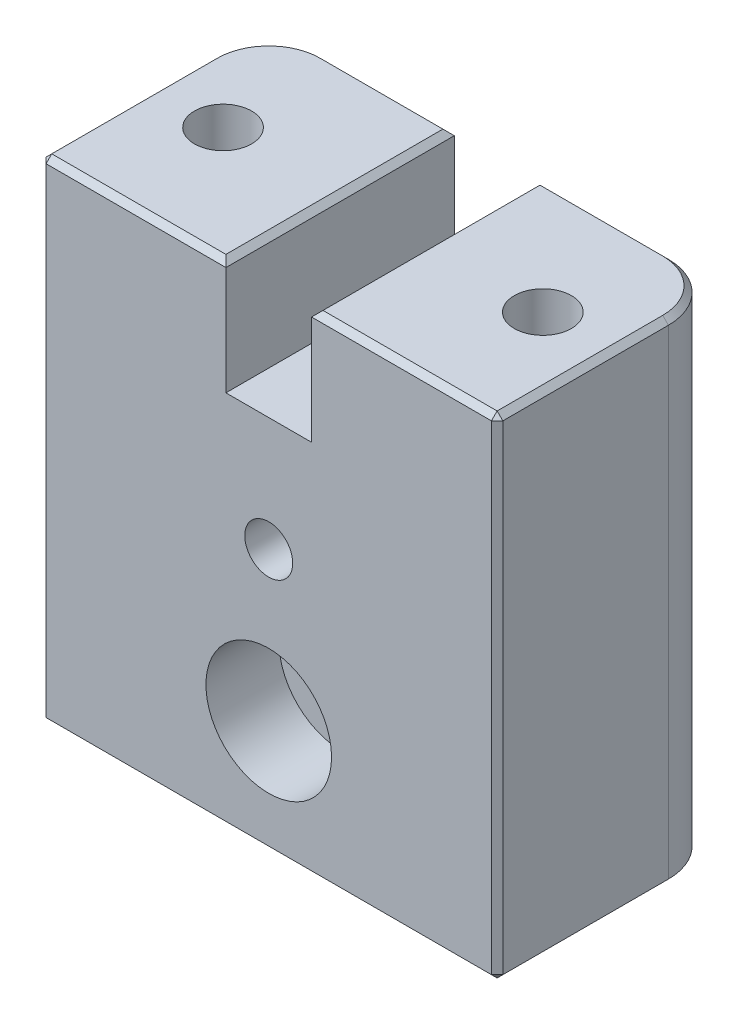
ISO-10303-21;
HEADER;
FILE_DESCRIPTION(('STEP AP214'),'2;1');
FILE_NAME('part.step','',(''),(''),'','','');
FILE_SCHEMA(('AUTOMOTIVE_DESIGN { 1 0 10303 214 1 1 1 1 }'));
ENDSEC;
DATA;
#1=APPLICATION_CONTEXT('core data for automotive mechanical design processes');
#2=APPLICATION_PROTOCOL_DEFINITION('international standard','automotive_design',2000,#1);
#3=PRODUCT_CONTEXT('',#1,'mechanical');
#4=PRODUCT('Part','Part','',(#3));
#5=PRODUCT_RELATED_PRODUCT_CATEGORY('part','',(#4));
#6=PRODUCT_DEFINITION_FORMATION('','',#4);
#7=PRODUCT_DEFINITION_CONTEXT('part definition',#1,'design');
#8=PRODUCT_DEFINITION('design','',#6,#7);
#9=PRODUCT_DEFINITION_SHAPE('','',#8);
#10=(LENGTH_UNIT() NAMED_UNIT(*) SI_UNIT(.MILLI.,.METRE.));
#11=(NAMED_UNIT(*) PLANE_ANGLE_UNIT() SI_UNIT($,.RADIAN.));
#12=(NAMED_UNIT(*) SI_UNIT($,.STERADIAN.) SOLID_ANGLE_UNIT());
#13=UNCERTAINTY_MEASURE_WITH_UNIT(LENGTH_MEASURE(1.E-05),#10,'distance_accuracy_value','');
#14=(GEOMETRIC_REPRESENTATION_CONTEXT(3) GLOBAL_UNCERTAINTY_ASSIGNED_CONTEXT((#13)) GLOBAL_UNIT_ASSIGNED_CONTEXT((#10,
#11,#12)) REPRESENTATION_CONTEXT('',''));
#15=CARTESIAN_POINT('',(0.,0.,0.));
#16=DIRECTION('',(0.,0.,1.));
#17=DIRECTION('',(1.,0.,0.));
#18=AXIS2_PLACEMENT_3D('',#15,#16,#17);
#19=CARTESIAN_POINT('',(-20.,21.5,20.));
#20=DIRECTION('',(0.,-1.,0.));
#21=DIRECTION('',(0.,0.,-1.));
#22=AXIS2_PLACEMENT_3D('',#19,#20,#21);
#23=PLANE('',#22);
#24=DIRECTION('',(0.,0.,-1.));
#25=VECTOR('',#24,1.);
#26=CARTESIAN_POINT('',(-4.25,21.5,20.));
#27=LINE('',#26,#25);
#28=CARTESIAN_POINT('',(-4.25,21.5,19.5));
#29=VERTEX_POINT('',#28);
#30=CARTESIAN_POINT('',(-4.25000000000001,21.5,0.500000000000007));
#31=VERTEX_POINT('',#30);
#32=EDGE_CURVE('E346',#29,#31,#27,.T.);
#33=ORIENTED_EDGE('',*,*,#32,.T.);
#34=DIRECTION('',(-1.,0.,0.));
#35=VECTOR('',#34,1.);
#36=CARTESIAN_POINT('',(-15.,21.5,0.500000000000007));
#37=LINE('',#36,#35);
#38=CARTESIAN_POINT('',(-15.,21.5,0.500000000000007));
#39=VERTEX_POINT('',#38);
#40=EDGE_CURVE('E352',#31,#39,#37,.T.);
#41=ORIENTED_EDGE('',*,*,#40,.T.);
#42=CARTESIAN_POINT('',(-15.,21.5,5.));
#43=DIRECTION('',(0.,-1.,0.));
#44=DIRECTION('',(0.,0.,-1.));
#45=AXIS2_PLACEMENT_3D('',#42,#43,#44);
#46=CIRCLE('',#45,4.49999999999999);
#47=CARTESIAN_POINT('',(-19.5,21.5,5.));
#48=VERTEX_POINT('',#47);
#49=EDGE_CURVE('E349',#39,#48,#46,.F.);
#50=ORIENTED_EDGE('',*,*,#49,.T.);
#51=DIRECTION('',(0.,0.,1.));
#52=VECTOR('',#51,1.);
#53=CARTESIAN_POINT('',(-19.5,21.5,20.));
#54=LINE('',#53,#52);
#55=CARTESIAN_POINT('',(-19.5,21.5,19.5));
#56=VERTEX_POINT('',#55);
#57=EDGE_CURVE('E340',#48,#56,#54,.T.);
#58=ORIENTED_EDGE('',*,*,#57,.T.);
#59=DIRECTION('',(1.,0.,0.));
#60=VECTOR('',#59,1.);
#61=CARTESIAN_POINT('',(-20.,21.5,19.5));
#62=LINE('',#61,#60);
#63=EDGE_CURVE('E343',#56,#29,#62,.T.);
#64=ORIENTED_EDGE('',*,*,#63,.T.);
#65=EDGE_LOOP('',(#33,#41,#50,#58,#64));
#66=FACE_BOUND('',#65,.T.);
#67=CARTESIAN_POINT('',(-14.,21.5,10.));
#68=DIRECTION('',(0.,1.,0.));
#69=DIRECTION('',(0.,0.,1.));
#70=AXIS2_PLACEMENT_3D('',#67,#68,#69);
#71=CIRCLE('',#70,2.5);
#72=CARTESIAN_POINT('',(-14.,21.5,12.5));
#73=VERTEX_POINT('',#72);
#74=EDGE_CURVE('E249',#73,#73,#71,.T.);
#75=ORIENTED_EDGE('',*,*,#74,.F.);
#76=EDGE_LOOP('',(#75));
#77=FACE_BOUND('',#76,.T.);
#78=ADVANCED_FACE('F68',(#66,#77),#23,.F.);
#79=CARTESIAN_POINT('',(20.,-21.5,20.));
#80=DIRECTION('',(-1.,0.,0.));
#81=DIRECTION('',(0.,0.,1.));
#82=AXIS2_PLACEMENT_3D('',#79,#80,#81);
#83=PLANE('',#82);
#84=DIRECTION('',(0.,-1.,0.));
#85=VECTOR('',#84,1.);
#86=CARTESIAN_POINT('',(20.,-21.5,19.5));
#87=LINE('',#86,#85);
#88=CARTESIAN_POINT('',(20.,21.,19.5));
#89=VERTEX_POINT('',#88);
#90=CARTESIAN_POINT('',(20.,-21.,19.5));
#91=VERTEX_POINT('',#90);
#92=EDGE_CURVE('E86',#89,#91,#87,.T.);
#93=ORIENTED_EDGE('',*,*,#92,.T.);
#94=DIRECTION('',(0.,0.,-1.));
#95=VECTOR('',#94,1.);
#96=CARTESIAN_POINT('',(20.,-21.,20.));
#97=LINE('',#96,#95);
#98=CARTESIAN_POINT('',(20.,-21.,5.));
#99=VERTEX_POINT('',#98);
#100=EDGE_CURVE('E13',#91,#99,#97,.T.);
#101=ORIENTED_EDGE('',*,*,#100,.T.);
#102=DIRECTION('',(0.,1.,0.));
#103=VECTOR('',#102,1.);
#104=CARTESIAN_POINT('',(20.,21.5,5.));
#105=LINE('',#104,#103);
#106=CARTESIAN_POINT('',(20.,21.,5.));
#107=VERTEX_POINT('',#106);
#108=EDGE_CURVE('E308',#99,#107,#105,.T.);
#109=ORIENTED_EDGE('',*,*,#108,.T.);
#110=DIRECTION('',(0.,0.,1.));
#111=VECTOR('',#110,1.);
#112=CARTESIAN_POINT('',(20.,21.,20.));
#113=LINE('',#112,#111);
#114=EDGE_CURVE('E79',#107,#89,#113,.T.);
#115=ORIENTED_EDGE('',*,*,#114,.T.);
#116=EDGE_LOOP('',(#93,#101,#109,#115));
#117=FACE_BOUND('',#116,.T.);
#118=ADVANCED_FACE('F601',(#117),#83,.F.);
#119=CARTESIAN_POINT('',(15.,21.5,5.));
#120=DIRECTION('',(0.,-1.,0.));
#121=DIRECTION('',(0.,0.,-1.));
#122=AXIS2_PLACEMENT_3D('',#119,#120,#121);
#123=CIRCLE('',#122,4.5);
#124=CARTESIAN_POINT('',(19.5,21.5,5.));
#125=VERTEX_POINT('',#124);
#126=CARTESIAN_POINT('',(15.,21.5,0.500000000000001));
#127=VERTEX_POINT('',#126);
#128=EDGE_CURVE('E365',#125,#127,#123,.F.);
#129=ORIENTED_EDGE('',*,*,#128,.T.);
#130=DIRECTION('',(-1.,0.,0.));
#131=VECTOR('',#130,1.);
#132=CARTESIAN_POINT('',(3.75,21.5,0.5));
#133=LINE('',#132,#131);
#134=CARTESIAN_POINT('',(4.25000000000001,21.5,0.5));
#135=VERTEX_POINT('',#134);
#136=EDGE_CURVE('E368',#127,#135,#133,.T.);
#137=ORIENTED_EDGE('',*,*,#136,.T.);
#138=DIRECTION('',(0.,0.,1.));
#139=VECTOR('',#138,1.);
#140=CARTESIAN_POINT('',(4.25000000000001,21.5,20.));
#141=LINE('',#140,#139);
#142=CARTESIAN_POINT('',(4.25000000000001,21.5,19.5));
#143=VERTEX_POINT('',#142);
#144=EDGE_CURVE('E362',#135,#143,#141,.T.);
#145=ORIENTED_EDGE('',*,*,#144,.T.);
#146=DIRECTION('',(1.,0.,0.));
#147=VECTOR('',#146,1.);
#148=CARTESIAN_POINT('',(-20.,21.5,19.5));
#149=LINE('',#148,#147);
#150=CARTESIAN_POINT('',(19.5,21.5,19.5));
#151=VERTEX_POINT('',#150);
#152=EDGE_CURVE('E359',#143,#151,#149,.T.);
#153=ORIENTED_EDGE('',*,*,#152,.T.);
#154=DIRECTION('',(0.,0.,-1.));
#155=VECTOR('',#154,1.);
#156=CARTESIAN_POINT('',(19.5,21.5,20.));
#157=LINE('',#156,#155);
#158=EDGE_CURVE('E356',#151,#125,#157,.T.);
#159=ORIENTED_EDGE('',*,*,#158,.T.);
#160=EDGE_LOOP('',(#129,#137,#145,#153,#159));
#161=FACE_BOUND('',#160,.T.);
#162=CARTESIAN_POINT('',(14.,21.5,10.));
#163=DIRECTION('',(0.,1.,0.));
#164=DIRECTION('',(0.,0.,1.));
#165=AXIS2_PLACEMENT_3D('',#162,#163,#164);
#166=CIRCLE('',#165,2.5);
#167=CARTESIAN_POINT('',(14.,21.5,12.5));
#168=VERTEX_POINT('',#167);
#169=EDGE_CURVE('E257',#168,#168,#166,.T.);
#170=ORIENTED_EDGE('',*,*,#169,.F.);
#171=EDGE_LOOP('',(#170));
#172=FACE_BOUND('',#171,.T.);
#173=ADVANCED_FACE('F603',(#161,#172),#23,.F.);
#174=CARTESIAN_POINT('',(-20.,-21.5,20.));
#175=DIRECTION('',(1.,0.,0.));
#176=DIRECTION('',(0.,0.,-1.));
#177=AXIS2_PLACEMENT_3D('',#174,#175,#176);
#178=PLANE('',#177);
#179=DIRECTION('',(0.,-1.,0.));
#180=VECTOR('',#179,1.);
#181=CARTESIAN_POINT('',(-20.,-21.5,5.));
#182=LINE('',#181,#180);
#183=CARTESIAN_POINT('',(-20.,21.,5.));
#184=VERTEX_POINT('',#183);
#185=CARTESIAN_POINT('',(-20.,-21.,5.));
#186=VERTEX_POINT('',#185);
#187=EDGE_CURVE('E285',#184,#186,#182,.T.);
#188=ORIENTED_EDGE('',*,*,#187,.T.);
#189=DIRECTION('',(0.,0.,1.));
#190=VECTOR('',#189,1.);
#191=CARTESIAN_POINT('',(-20.,-21.,20.));
#192=LINE('',#191,#190);
#193=CARTESIAN_POINT('',(-20.,-21.,19.5));
#194=VERTEX_POINT('',#193);
#195=EDGE_CURVE('E411',#186,#194,#192,.T.);
#196=ORIENTED_EDGE('',*,*,#195,.T.);
#197=DIRECTION('',(0.,1.,0.));
#198=VECTOR('',#197,1.);
#199=CARTESIAN_POINT('',(-20.,-21.5,19.5));
#200=LINE('',#199,#198);
#201=CARTESIAN_POINT('',(-20.,21.,19.5));
#202=VERTEX_POINT('',#201);
#203=EDGE_CURVE('E405',#194,#202,#200,.T.);
#204=ORIENTED_EDGE('',*,*,#203,.T.);
#205=DIRECTION('',(0.,0.,-1.));
#206=VECTOR('',#205,1.);
#207=CARTESIAN_POINT('',(-20.,21.,20.));
#208=LINE('',#207,#206);
#209=EDGE_CURVE('E408',#202,#184,#208,.T.);
#210=ORIENTED_EDGE('',*,*,#209,.T.);
#211=EDGE_LOOP('',(#188,#196,#204,#210));
#212=FACE_BOUND('',#211,.T.);
#213=ADVANCED_FACE('F555',(#212),#178,.F.);
#214=CARTESIAN_POINT('',(-20.,-21.5,20.));
#215=DIRECTION('',(0.,1.,0.));
#216=DIRECTION('',(0.,0.,1.));
#217=AXIS2_PLACEMENT_3D('',#214,#215,#216);
#218=PLANE('',#217);
#219=CARTESIAN_POINT('',(-15.,-21.5,5.));
#220=DIRECTION('',(0.,1.,0.));
#221=DIRECTION('',(0.,0.,1.));
#222=AXIS2_PLACEMENT_3D('',#219,#220,#221);
#223=CIRCLE('',#222,4.5);
#224=CARTESIAN_POINT('',(-19.5,-21.5,5.));
#225=VERTEX_POINT('',#224);
#226=CARTESIAN_POINT('',(-15.,-21.5,0.5));
#227=VERTEX_POINT('',#226);
#228=EDGE_CURVE('E323',#225,#227,#223,.F.);
#229=ORIENTED_EDGE('',*,*,#228,.T.);
#230=DIRECTION('',(1.,0.,0.));
#231=VECTOR('',#230,1.);
#232=CARTESIAN_POINT('',(15.,-21.5,0.5));
#233=LINE('',#232,#231);
#234=CARTESIAN_POINT('',(15.,-21.5,0.5));
#235=VERTEX_POINT('',#234);
#236=EDGE_CURVE('E326',#227,#235,#233,.T.);
#237=ORIENTED_EDGE('',*,*,#236,.T.);
#238=CARTESIAN_POINT('',(15.,-21.5,5.));
#239=DIRECTION('',(0.,1.,0.));
#240=DIRECTION('',(0.,0.,1.));
#241=AXIS2_PLACEMENT_3D('',#238,#239,#240);
#242=CIRCLE('',#241,4.5);
#243=CARTESIAN_POINT('',(19.5,-21.5,5.));
#244=VERTEX_POINT('',#243);
#245=EDGE_CURVE('E320',#235,#244,#242,.F.);
#246=ORIENTED_EDGE('',*,*,#245,.T.);
#247=DIRECTION('',(0.,0.,1.));
#248=VECTOR('',#247,1.);
#249=CARTESIAN_POINT('',(19.5,-21.5,20.));
#250=LINE('',#249,#248);
#251=CARTESIAN_POINT('',(19.5,-21.5,19.5));
#252=VERTEX_POINT('',#251);
#253=EDGE_CURVE('E314',#244,#252,#250,.T.);
#254=ORIENTED_EDGE('',*,*,#253,.T.);
#255=DIRECTION('',(-1.,0.,0.));
#256=VECTOR('',#255,1.);
#257=CARTESIAN_POINT('',(-20.,-21.5,19.5));
#258=LINE('',#257,#256);
#259=CARTESIAN_POINT('',(-19.5,-21.5,19.5));
#260=VERTEX_POINT('',#259);
#261=EDGE_CURVE('E311',#252,#260,#258,.T.);
#262=ORIENTED_EDGE('',*,*,#261,.T.);
#263=DIRECTION('',(0.,0.,-1.));
#264=VECTOR('',#263,1.);
#265=CARTESIAN_POINT('',(-19.5,-21.5,20.));
#266=LINE('',#265,#264);
#267=EDGE_CURVE('E317',#260,#225,#266,.T.);
#268=ORIENTED_EDGE('',*,*,#267,.T.);
#269=EDGE_LOOP('',(#229,#237,#246,#254,#262,#268));
#270=FACE_BOUND('',#269,.T.);
#271=ADVANCED_FACE('F569',(#270),#218,.F.);
#272=CARTESIAN_POINT('',(0.,0.,20.));
#273=DIRECTION('',(0.,0.,-1.));
#274=DIRECTION('',(-1.,0.,0.));
#275=AXIS2_PLACEMENT_3D('',#272,#273,#274);
#276=PLANE('',#275);
#277=CARTESIAN_POINT('',(0.,1.5,20.));
#278=DIRECTION('',(0.,0.,1.));
#279=DIRECTION('',(1.,0.,0.));
#280=AXIS2_PLACEMENT_3D('',#277,#278,#279);
#281=CIRCLE('',#280,2.09999999999999);
#282=CARTESIAN_POINT('',(2.09999999999999,1.5,20.));
#283=VERTEX_POINT('',#282);
#284=EDGE_CURVE('E226',#283,#283,#281,.T.);
#285=ORIENTED_EDGE('',*,*,#284,.F.);
#286=EDGE_LOOP('',(#285));
#287=FACE_BOUND('',#286,.T.);
#288=CARTESIAN_POINT('',(0.,-11.5,20.));
#289=DIRECTION('',(0.,0.,1.));
#290=DIRECTION('',(1.,0.,0.));
#291=AXIS2_PLACEMENT_3D('',#288,#289,#290);
#292=CIRCLE('',#291,5.5);
#293=CARTESIAN_POINT('',(5.5,-11.5,20.));
#294=VERTEX_POINT('',#293);
#295=EDGE_CURVE('E225',#294,#294,#292,.T.);
#296=ORIENTED_EDGE('',*,*,#295,.F.);
#297=EDGE_LOOP('',(#296));
#298=FACE_BOUND('',#297,.T.);
#299=DIRECTION('',(0.,1.,0.));
#300=VECTOR('',#299,1.);
#301=CARTESIAN_POINT('',(19.5,0.,20.));
#302=LINE('',#301,#300);
#303=CARTESIAN_POINT('',(19.5,-21.,20.));
#304=VERTEX_POINT('',#303);
#305=CARTESIAN_POINT('',(19.5,21.,20.));
#306=VERTEX_POINT('',#305);
#307=EDGE_CURVE('E390',#304,#306,#302,.T.);
#308=ORIENTED_EDGE('',*,*,#307,.T.);
#309=DIRECTION('',(-1.,0.,0.));
#310=VECTOR('',#309,1.);
#311=CARTESIAN_POINT('',(0.,21.,20.));
#312=LINE('',#311,#310);
#313=CARTESIAN_POINT('',(3.75,21.,20.));
#314=VERTEX_POINT('',#313);
#315=EDGE_CURVE('E402',#306,#314,#312,.T.);
#316=ORIENTED_EDGE('',*,*,#315,.T.);
#317=DIRECTION('',(0.,1.,0.));
#318=VECTOR('',#317,1.);
#319=CARTESIAN_POINT('',(3.75,11.5,20.));
#320=LINE('',#319,#318);
#321=CARTESIAN_POINT('',(3.75,11.5,20.));
#322=VERTEX_POINT('',#321);
#323=EDGE_CURVE('E290',#322,#314,#320,.T.);
#324=ORIENTED_EDGE('',*,*,#323,.F.);
#325=DIRECTION('',(1.,0.,0.));
#326=VECTOR('',#325,1.);
#327=CARTESIAN_POINT('',(-3.75,11.5,20.));
#328=LINE('',#327,#326);
#329=CARTESIAN_POINT('',(-3.75,11.5,20.));
#330=VERTEX_POINT('',#329);
#331=EDGE_CURVE('E269',#330,#322,#328,.T.);
#332=ORIENTED_EDGE('',*,*,#331,.F.);
#333=DIRECTION('',(0.,1.,0.));
#334=VECTOR('',#333,1.);
#335=CARTESIAN_POINT('',(-3.75,11.5,20.));
#336=LINE('',#335,#334);
#337=CARTESIAN_POINT('',(-3.75,21.,20.));
#338=VERTEX_POINT('',#337);
#339=EDGE_CURVE('E280',#330,#338,#336,.T.);
#340=ORIENTED_EDGE('',*,*,#339,.T.);
#341=DIRECTION('',(-1.,0.,0.));
#342=VECTOR('',#341,1.);
#343=CARTESIAN_POINT('',(0.,21.,20.));
#344=LINE('',#343,#342);
#345=CARTESIAN_POINT('',(-19.5,21.,20.));
#346=VERTEX_POINT('',#345);
#347=EDGE_CURVE('E399',#338,#346,#344,.T.);
#348=ORIENTED_EDGE('',*,*,#347,.T.);
#349=DIRECTION('',(0.,-1.,0.));
#350=VECTOR('',#349,1.);
#351=CARTESIAN_POINT('',(-19.5,0.,20.));
#352=LINE('',#351,#350);
#353=CARTESIAN_POINT('',(-19.5,-21.,20.));
#354=VERTEX_POINT('',#353);
#355=EDGE_CURVE('E396',#346,#354,#352,.T.);
#356=ORIENTED_EDGE('',*,*,#355,.T.);
#357=DIRECTION('',(1.,0.,0.));
#358=VECTOR('',#357,1.);
#359=CARTESIAN_POINT('',(0.,-21.,20.));
#360=LINE('',#359,#358);
#361=EDGE_CURVE('E393',#354,#304,#360,.T.);
#362=ORIENTED_EDGE('',*,*,#361,.T.);
#363=EDGE_LOOP('',(#308,#316,#324,#332,#340,#348,#356,#362));
#364=FACE_BOUND('',#363,.T.);
#365=ADVANCED_FACE('F533',(#287,#298,#364),#276,.F.);
#366=CARTESIAN_POINT('',(0.,0.,0.));
#367=DIRECTION('',(0.,0.,-1.));
#368=DIRECTION('',(-1.,0.,0.));
#369=AXIS2_PLACEMENT_3D('',#366,#367,#368);
#370=PLANE('',#369);
#371=CARTESIAN_POINT('',(0.,-11.5,0.));
#372=DIRECTION('',(0.,0.,1.));
#373=DIRECTION('',(1.,0.,0.));
#374=AXIS2_PLACEMENT_3D('',#371,#372,#373);
#375=CIRCLE('',#374,3.2);
#376=CARTESIAN_POINT('',(3.2,-11.5,0.));
#377=VERTEX_POINT('',#376);
#378=EDGE_CURVE('E244',#377,#377,#375,.T.);
#379=ORIENTED_EDGE('',*,*,#378,.T.);
#380=EDGE_LOOP('',(#379));
#381=FACE_BOUND('',#380,.T.);
#382=DIRECTION('',(0.,1.,0.));
#383=VECTOR('',#382,1.);
#384=CARTESIAN_POINT('',(15.,-21.5,0.));
#385=LINE('',#384,#383);
#386=CARTESIAN_POINT('',(15.,21.,0.));
#387=VERTEX_POINT('',#386);
#388=CARTESIAN_POINT('',(15.,-21.,0.));
#389=VERTEX_POINT('',#388);
#390=EDGE_CURVE('E300',#387,#389,#385,.F.);
#391=ORIENTED_EDGE('',*,*,#390,.T.);
#392=DIRECTION('',(-1.,0.,0.));
#393=VECTOR('',#392,1.);
#394=CARTESIAN_POINT('',(-15.,-21.,0.));
#395=LINE('',#394,#393);
#396=CARTESIAN_POINT('',(-15.,-21.,0.));
#397=VERTEX_POINT('',#396);
#398=EDGE_CURVE('E336',#389,#397,#395,.T.);
#399=ORIENTED_EDGE('',*,*,#398,.T.);
#400=DIRECTION('',(0.,-1.,0.));
#401=VECTOR('',#400,1.);
#402=CARTESIAN_POINT('',(-15.,21.5,0.));
#403=LINE('',#402,#401);
#404=CARTESIAN_POINT('',(-15.,21.,0.));
#405=VERTEX_POINT('',#404);
#406=EDGE_CURVE('E304',#397,#405,#403,.F.);
#407=ORIENTED_EDGE('',*,*,#406,.T.);
#408=DIRECTION('',(1.,0.,0.));
#409=VECTOR('',#408,1.);
#410=CARTESIAN_POINT('',(-3.75,21.,0.));
#411=LINE('',#410,#409);
#412=CARTESIAN_POINT('',(-3.75,21.,0.));
#413=VERTEX_POINT('',#412);
#414=EDGE_CURVE('E333',#405,#413,#411,.T.);
#415=ORIENTED_EDGE('',*,*,#414,.T.);
#416=DIRECTION('',(0.,1.,0.));
#417=VECTOR('',#416,1.);
#418=CARTESIAN_POINT('',(-3.75,11.5,0.));
#419=LINE('',#418,#417);
#420=CARTESIAN_POINT('',(-3.75,11.5,0.));
#421=VERTEX_POINT('',#420);
#422=EDGE_CURVE('E281',#421,#413,#419,.T.);
#423=ORIENTED_EDGE('',*,*,#422,.F.);
#424=DIRECTION('',(-1.,0.,0.));
#425=VECTOR('',#424,1.);
#426=CARTESIAN_POINT('',(-3.75,11.5,0.));
#427=LINE('',#426,#425);
#428=CARTESIAN_POINT('',(3.75,11.5,0.));
#429=VERTEX_POINT('',#428);
#430=EDGE_CURVE('E276',#429,#421,#427,.T.);
#431=ORIENTED_EDGE('',*,*,#430,.F.);
#432=DIRECTION('',(0.,1.,0.));
#433=VECTOR('',#432,1.);
#434=CARTESIAN_POINT('',(3.75,11.5,0.));
#435=LINE('',#434,#433);
#436=CARTESIAN_POINT('',(3.75,21.,0.));
#437=VERTEX_POINT('',#436);
#438=EDGE_CURVE('E286',#429,#437,#435,.T.);
#439=ORIENTED_EDGE('',*,*,#438,.T.);
#440=DIRECTION('',(1.,0.,0.));
#441=VECTOR('',#440,1.);
#442=CARTESIAN_POINT('',(15.,21.,0.));
#443=LINE('',#442,#441);
#444=EDGE_CURVE('E330',#437,#387,#443,.T.);
#445=ORIENTED_EDGE('',*,*,#444,.T.);
#446=EDGE_LOOP('',(#391,#399,#407,#415,#423,#431,#439,#445));
#447=FACE_BOUND('',#446,.T.);
#448=ADVANCED_FACE('F546',(#381,#447),#370,.T.);
#449=CARTESIAN_POINT('',(-3.75,11.5,0.));
#450=DIRECTION('',(-1.,0.,0.));
#451=DIRECTION('',(0.,0.,1.));
#452=AXIS2_PLACEMENT_3D('',#449,#450,#451);
#453=PLANE('',#452);
#454=ORIENTED_EDGE('',*,*,#422,.T.);
#455=DIRECTION('',(0.,0.,1.));
#456=VECTOR('',#455,1.);
#457=CARTESIAN_POINT('',(-3.75,21.,0.));
#458=LINE('',#457,#456);
#459=EDGE_CURVE('E384',#413,#338,#458,.T.);
#460=ORIENTED_EDGE('',*,*,#459,.T.);
#461=ORIENTED_EDGE('',*,*,#339,.F.);
#462=DIRECTION('',(0.,0.,1.));
#463=VECTOR('',#462,1.);
#464=CARTESIAN_POINT('',(-3.75,11.5,0.));
#465=LINE('',#464,#463);
#466=EDGE_CURVE('E265',#421,#330,#465,.T.);
#467=ORIENTED_EDGE('',*,*,#466,.F.);
#468=EDGE_LOOP('',(#454,#460,#461,#467));
#469=FACE_BOUND('',#468,.T.);
#470=ADVANCED_FACE('F539',(#469),#453,.F.);
#471=CARTESIAN_POINT('',(3.75,11.5,0.));
#472=DIRECTION('',(1.,0.,0.));
#473=DIRECTION('',(0.,0.,-1.));
#474=AXIS2_PLACEMENT_3D('',#471,#472,#473);
#475=PLANE('',#474);
#476=ORIENTED_EDGE('',*,*,#323,.T.);
#477=DIRECTION('',(0.,0.,-1.));
#478=VECTOR('',#477,1.);
#479=CARTESIAN_POINT('',(3.75,21.,0.));
#480=LINE('',#479,#478);
#481=EDGE_CURVE('E387',#314,#437,#480,.T.);
#482=ORIENTED_EDGE('',*,*,#481,.T.);
#483=ORIENTED_EDGE('',*,*,#438,.F.);
#484=DIRECTION('',(0.,0.,-1.));
#485=VECTOR('',#484,1.);
#486=CARTESIAN_POINT('',(3.75,11.5,0.));
#487=LINE('',#486,#485);
#488=EDGE_CURVE('E273',#322,#429,#487,.T.);
#489=ORIENTED_EDGE('',*,*,#488,.F.);
#490=EDGE_LOOP('',(#476,#482,#483,#489));
#491=FACE_BOUND('',#490,.T.);
#492=ADVANCED_FACE('F641',(#491),#475,.F.);
#493=CARTESIAN_POINT('',(0.,11.5,0.));
#494=DIRECTION('',(0.,1.,0.));
#495=DIRECTION('',(0.,0.,1.));
#496=AXIS2_PLACEMENT_3D('',#493,#494,#495);
#497=PLANE('',#496);
#498=ORIENTED_EDGE('',*,*,#466,.T.);
#499=ORIENTED_EDGE('',*,*,#331,.T.);
#500=ORIENTED_EDGE('',*,*,#488,.T.);
#501=ORIENTED_EDGE('',*,*,#430,.T.);
#502=EDGE_LOOP('',(#498,#499,#500,#501));
#503=FACE_BOUND('',#502,.T.);
#504=ADVANCED_FACE('F541',(#503),#497,.T.);
#505=CARTESIAN_POINT('',(14.,6.5,10.));
#506=DIRECTION('',(0.,1.,0.));
#507=DIRECTION('',(0.,0.,1.));
#508=AXIS2_PLACEMENT_3D('',#505,#506,#507);
#509=CONICAL_SURFACE('',#508,2.5,1.02974425867665);
#510=CARTESIAN_POINT('',(14.,4.9978484524311,10.));
#511=VERTEX_POINT('',#510);
#512=VERTEX_LOOP('',#511);
#513=FACE_BOUND('',#512,.T.);
#514=CARTESIAN_POINT('',(14.,6.5,10.));
#515=DIRECTION('',(0.,1.,0.));
#516=DIRECTION('',(0.,0.,1.));
#517=AXIS2_PLACEMENT_3D('',#514,#515,#516);
#518=CIRCLE('',#517,2.5);
#519=CARTESIAN_POINT('',(14.,6.5,12.5));
#520=VERTEX_POINT('',#519);
#521=EDGE_CURVE('E261',#520,#520,#518,.T.);
#522=ORIENTED_EDGE('',*,*,#521,.T.);
#523=EDGE_LOOP('',(#522));
#524=FACE_BOUND('',#523,.T.);
#525=ADVANCED_FACE('F623',(#513,#524),#509,.F.);
#526=CARTESIAN_POINT('',(14.,21.5,10.));
#527=DIRECTION('',(0.,1.,0.));
#528=DIRECTION('',(0.,0.,1.));
#529=AXIS2_PLACEMENT_3D('',#526,#527,#528);
#530=CYLINDRICAL_SURFACE('',#529,2.5);
#531=ORIENTED_EDGE('',*,*,#521,.F.);
#532=EDGE_LOOP('',(#531));
#533=FACE_BOUND('',#532,.T.);
#534=ORIENTED_EDGE('',*,*,#169,.T.);
#535=EDGE_LOOP('',(#534));
#536=FACE_BOUND('',#535,.T.);
#537=ADVANCED_FACE('F620',(#533,#536),#530,.F.);
#538=CARTESIAN_POINT('',(-14.,6.5,10.));
#539=DIRECTION('',(0.,1.,0.));
#540=DIRECTION('',(0.,0.,1.));
#541=AXIS2_PLACEMENT_3D('',#538,#539,#540);
#542=CONICAL_SURFACE('',#541,2.5,1.02974425867665);
#543=CARTESIAN_POINT('',(-14.,4.9978484524311,10.));
#544=VERTEX_POINT('',#543);
#545=VERTEX_LOOP('',#544);
#546=FACE_BOUND('',#545,.T.);
#547=CARTESIAN_POINT('',(-14.,6.5,10.));
#548=DIRECTION('',(0.,1.,0.));
#549=DIRECTION('',(0.,0.,1.));
#550=AXIS2_PLACEMENT_3D('',#547,#548,#549);
#551=CIRCLE('',#550,2.5);
#552=CARTESIAN_POINT('',(-14.,6.5,12.5));
#553=VERTEX_POINT('',#552);
#554=EDGE_CURVE('E253',#553,#553,#551,.T.);
#555=ORIENTED_EDGE('',*,*,#554,.T.);
#556=EDGE_LOOP('',(#555));
#557=FACE_BOUND('',#556,.T.);
#558=ADVANCED_FACE('F622',(#546,#557),#542,.F.);
#559=CARTESIAN_POINT('',(-14.,21.5,10.));
#560=DIRECTION('',(0.,1.,0.));
#561=DIRECTION('',(0.,0.,1.));
#562=AXIS2_PLACEMENT_3D('',#559,#560,#561);
#563=CYLINDRICAL_SURFACE('',#562,2.5);
#564=ORIENTED_EDGE('',*,*,#554,.F.);
#565=EDGE_LOOP('',(#564));
#566=FACE_BOUND('',#565,.T.);
#567=ORIENTED_EDGE('',*,*,#74,.T.);
#568=EDGE_LOOP('',(#567));
#569=FACE_BOUND('',#568,.T.);
#570=ADVANCED_FACE('F630',(#566,#569),#563,.F.);
#571=CARTESIAN_POINT('',(-15.,-21.5,5.));
#572=DIRECTION('',(0.,1.,0.));
#573=DIRECTION('',(0.,0.,1.));
#574=AXIS2_PLACEMENT_3D('',#571,#572,#573);
#575=CYLINDRICAL_SURFACE('',#574,5.);
#576=ORIENTED_EDGE('',*,*,#406,.F.);
#577=CARTESIAN_POINT('',(-15.,-21.,5.));
#578=DIRECTION('',(0.,1.,0.));
#579=DIRECTION('',(0.,0.,1.));
#580=AXIS2_PLACEMENT_3D('',#577,#578,#579);
#581=CIRCLE('',#580,5.);
#582=EDGE_CURVE('E375',#397,#186,#581,.T.);
#583=ORIENTED_EDGE('',*,*,#582,.T.);
#584=ORIENTED_EDGE('',*,*,#187,.F.);
#585=CARTESIAN_POINT('',(-15.,21.,5.));
#586=DIRECTION('',(0.,-1.,0.));
#587=DIRECTION('',(0.,0.,-1.));
#588=AXIS2_PLACEMENT_3D('',#585,#586,#587);
#589=CIRCLE('',#588,5.);
#590=EDGE_CURVE('E372',#184,#405,#589,.T.);
#591=ORIENTED_EDGE('',*,*,#590,.T.);
#592=EDGE_LOOP('',(#576,#583,#584,#591));
#593=FACE_BOUND('',#592,.T.);
#594=ADVANCED_FACE('F550',(#593),#575,.T.);
#595=CARTESIAN_POINT('',(15.,-21.5,5.));
#596=DIRECTION('',(0.,-1.,0.));
#597=DIRECTION('',(0.,0.,-1.));
#598=AXIS2_PLACEMENT_3D('',#595,#596,#597);
#599=CYLINDRICAL_SURFACE('',#598,5.);
#600=ORIENTED_EDGE('',*,*,#108,.F.);
#601=CARTESIAN_POINT('',(15.,-21.,5.));
#602=DIRECTION('',(0.,1.,0.));
#603=DIRECTION('',(0.,0.,1.));
#604=AXIS2_PLACEMENT_3D('',#601,#602,#603);
#605=CIRCLE('',#604,5.);
#606=EDGE_CURVE('E381',#99,#389,#605,.T.);
#607=ORIENTED_EDGE('',*,*,#606,.T.);
#608=ORIENTED_EDGE('',*,*,#390,.F.);
#609=CARTESIAN_POINT('',(15.,21.,5.));
#610=DIRECTION('',(0.,-1.,0.));
#611=DIRECTION('',(0.,0.,-1.));
#612=AXIS2_PLACEMENT_3D('',#609,#610,#611);
#613=CIRCLE('',#612,5.);
#614=EDGE_CURVE('E378',#387,#107,#613,.T.);
#615=ORIENTED_EDGE('',*,*,#614,.T.);
#616=EDGE_LOOP('',(#600,#607,#608,#615));
#617=FACE_BOUND('',#616,.T.);
#618=ADVANCED_FACE('F678',(#617),#599,.T.);
#619=CARTESIAN_POINT('',(-20.,21.5,0.500000000000007));
#620=DIRECTION('',(0.,0.707106781186552,-0.707106781186542));
#621=DIRECTION('',(1.,0.,0.));
#622=AXIS2_PLACEMENT_3D('',#619,#620,#621);
#623=PLANE('',#622);
#624=DIRECTION('',(0.577350269189628,-0.577350269189621,-0.577350269189629));
#625=VECTOR('',#624,1.);
#626=CARTESIAN_POINT('',(-3.75,21.,0.));
#627=LINE('',#626,#625);
#628=EDGE_CURVE('E502',#413,#31,#627,.F.);
#629=ORIENTED_EDGE('',*,*,#628,.F.);
#630=ORIENTED_EDGE('',*,*,#414,.F.);
#631=DIRECTION('',(0.,-0.707106781186542,-0.707106781186552));
#632=VECTOR('',#631,1.);
#633=CARTESIAN_POINT('',(-15.,21.5,0.500000000000007));
#634=LINE('',#633,#632);
#635=EDGE_CURVE('E73',#39,#405,#634,.T.);
#636=ORIENTED_EDGE('',*,*,#635,.F.);
#637=ORIENTED_EDGE('',*,*,#40,.F.);
#638=EDGE_LOOP('',(#629,#630,#636,#637));
#639=FACE_BOUND('',#638,.T.);
#640=ADVANCED_FACE('F71',(#639),#623,.T.);
#641=CARTESIAN_POINT('',(-20.,21.5,0.5));
#642=DIRECTION('',(0.,0.707106781186542,-0.707106781186552));
#643=DIRECTION('',(1.,0.,0.));
#644=AXIS2_PLACEMENT_3D('',#641,#642,#643);
#645=PLANE('',#644);
#646=DIRECTION('',(0.,0.707106781186552,0.707106781186542));
#647=VECTOR('',#646,1.);
#648=CARTESIAN_POINT('',(15.,21.,0.));
#649=LINE('',#648,#647);
#650=EDGE_CURVE('E495',#387,#127,#649,.T.);
#651=ORIENTED_EDGE('',*,*,#650,.F.);
#652=ORIENTED_EDGE('',*,*,#444,.F.);
#653=DIRECTION('',(0.577350269189635,0.577350269189626,0.577350269189617));
#654=VECTOR('',#653,1.);
#655=CARTESIAN_POINT('',(3.75,21.,0.));
#656=LINE('',#655,#654);
#657=EDGE_CURVE('E499',#135,#437,#656,.F.);
#658=ORIENTED_EDGE('',*,*,#657,.F.);
#659=ORIENTED_EDGE('',*,*,#136,.F.);
#660=EDGE_LOOP('',(#651,#652,#658,#659));
#661=FACE_BOUND('',#660,.T.);
#662=ADVANCED_FACE('F695',(#661),#645,.T.);
#663=CARTESIAN_POINT('',(-15.,21.5,5.));
#664=DIRECTION('',(0.,-1.,0.));
#665=DIRECTION('',(0.,0.,-1.));
#666=AXIS2_PLACEMENT_3D('',#663,#664,#665);
#667=CONICAL_SURFACE('',#666,4.49999999999999,0.785398163397454);
#668=ORIENTED_EDGE('',*,*,#635,.T.);
#669=ORIENTED_EDGE('',*,*,#590,.F.);
#670=DIRECTION('',(-0.707106781186552,-0.707106781186542,0.));
#671=VECTOR('',#670,1.);
#672=CARTESIAN_POINT('',(-19.5,21.5,5.));
#673=LINE('',#672,#671);
#674=EDGE_CURVE('E491',#48,#184,#673,.T.);
#675=ORIENTED_EDGE('',*,*,#674,.F.);
#676=ORIENTED_EDGE('',*,*,#49,.F.);
#677=EDGE_LOOP('',(#668,#669,#675,#676));
#678=FACE_BOUND('',#677,.T.);
#679=ADVANCED_FACE('F516',(#678),#667,.T.);
#680=CARTESIAN_POINT('',(-3.75,21.,0.));
#681=DIRECTION('',(-0.707106781186543,-0.707106781186552,0.));
#682=DIRECTION('',(0.,0.,1.));
#683=AXIS2_PLACEMENT_3D('',#680,#681,#682);
#684=PLANE('',#683);
#685=ORIENTED_EDGE('',*,*,#628,.T.);
#686=ORIENTED_EDGE('',*,*,#32,.F.);
#687=DIRECTION('',(-0.577350269189628,0.577350269189621,-0.577350269189629));
#688=VECTOR('',#687,1.);
#689=CARTESIAN_POINT('',(-2.49999999999999,19.75,21.25));
#690=LINE('',#689,#688);
#691=EDGE_CURVE('E487',#338,#29,#690,.T.);
#692=ORIENTED_EDGE('',*,*,#691,.F.);
#693=ORIENTED_EDGE('',*,*,#459,.F.);
#694=EDGE_LOOP('',(#685,#686,#692,#693));
#695=FACE_BOUND('',#694,.T.);
#696=ADVANCED_FACE('F525',(#695),#684,.F.);
#697=CARTESIAN_POINT('',(3.75,21.,0.));
#698=DIRECTION('',(0.707106781186542,-0.707106781186553,0.));
#699=DIRECTION('',(0.,0.,-1.));
#700=AXIS2_PLACEMENT_3D('',#697,#698,#699);
#701=PLANE('',#700);
#702=ORIENTED_EDGE('',*,*,#657,.T.);
#703=ORIENTED_EDGE('',*,*,#481,.F.);
#704=DIRECTION('',(-0.577350269189629,-0.57735026918962,0.577350269189628));
#705=VECTOR('',#704,1.);
#706=CARTESIAN_POINT('',(2.49999999999999,19.75,21.25));
#707=LINE('',#706,#705);
#708=EDGE_CURVE('E483',#143,#314,#707,.T.);
#709=ORIENTED_EDGE('',*,*,#708,.F.);
#710=ORIENTED_EDGE('',*,*,#144,.F.);
#711=EDGE_LOOP('',(#702,#703,#709,#710));
#712=FACE_BOUND('',#711,.T.);
#713=ADVANCED_FACE('F716',(#712),#701,.F.);
#714=CARTESIAN_POINT('',(15.,21.5,5.));
#715=DIRECTION('',(0.,-1.,0.));
#716=DIRECTION('',(0.,0.,-1.));
#717=AXIS2_PLACEMENT_3D('',#714,#715,#716);
#718=CONICAL_SURFACE('',#717,4.5,0.785398163397441);
#719=ORIENTED_EDGE('',*,*,#650,.T.);
#720=ORIENTED_EDGE('',*,*,#128,.F.);
#721=DIRECTION('',(-0.707106781186542,0.707106781186552,0.));
#722=VECTOR('',#721,1.);
#723=CARTESIAN_POINT('',(20.,21.,5.));
#724=LINE('',#723,#722);
#725=EDGE_CURVE('E479',#107,#125,#724,.T.);
#726=ORIENTED_EDGE('',*,*,#725,.F.);
#727=ORIENTED_EDGE('',*,*,#614,.F.);
#728=EDGE_LOOP('',(#719,#720,#726,#727));
#729=FACE_BOUND('',#728,.T.);
#730=ADVANCED_FACE('F724',(#729),#718,.T.);
#731=CARTESIAN_POINT('',(-20.,21.,20.));
#732=DIRECTION('',(0.707106781186542,-0.707106781186552,0.));
#733=DIRECTION('',(0.,0.,-1.));
#734=AXIS2_PLACEMENT_3D('',#731,#732,#733);
#735=PLANE('',#734);
#736=ORIENTED_EDGE('',*,*,#674,.T.);
#737=ORIENTED_EDGE('',*,*,#209,.F.);
#738=DIRECTION('',(0.707106781186552,0.707106781186543,0.));
#739=VECTOR('',#738,1.);
#740=CARTESIAN_POINT('',(-19.75,21.25,19.5));
#741=LINE('',#740,#739);
#742=EDGE_CURVE('E475',#56,#202,#741,.F.);
#743=ORIENTED_EDGE('',*,*,#742,.F.);
#744=ORIENTED_EDGE('',*,*,#57,.F.);
#745=EDGE_LOOP('',(#736,#737,#743,#744));
#746=FACE_BOUND('',#745,.T.);
#747=ADVANCED_FACE('F582',(#746),#735,.F.);
#748=CARTESIAN_POINT('',(0.,21.,20.));
#749=DIRECTION('',(0.,-0.707106781186552,-0.707106781186542));
#750=DIRECTION('',(-1.,0.,0.));
#751=AXIS2_PLACEMENT_3D('',#748,#749,#750);
#752=PLANE('',#751);
#753=ORIENTED_EDGE('',*,*,#691,.T.);
#754=ORIENTED_EDGE('',*,*,#63,.F.);
#755=DIRECTION('',(0.,-0.707106781186543,0.707106781186552));
#756=VECTOR('',#755,1.);
#757=CARTESIAN_POINT('',(-19.5,21.,20.));
#758=LINE('',#757,#756);
#759=EDGE_CURVE('E471',#346,#56,#758,.F.);
#760=ORIENTED_EDGE('',*,*,#759,.F.);
#761=ORIENTED_EDGE('',*,*,#347,.F.);
#762=EDGE_LOOP('',(#753,#754,#760,#761));
#763=FACE_BOUND('',#762,.T.);
#764=ADVANCED_FACE('F528',(#763),#752,.F.);
#765=CARTESIAN_POINT('',(0.,21.,20.));
#766=DIRECTION('',(0.,-0.707106781186552,-0.707106781186542));
#767=DIRECTION('',(-1.,0.,0.));
#768=AXIS2_PLACEMENT_3D('',#765,#766,#767);
#769=PLANE('',#768);
#770=ORIENTED_EDGE('',*,*,#708,.T.);
#771=ORIENTED_EDGE('',*,*,#315,.F.);
#772=DIRECTION('',(0.,0.707106781186543,-0.707106781186552));
#773=VECTOR('',#772,1.);
#774=CARTESIAN_POINT('',(19.5,21.5,19.5));
#775=LINE('',#774,#773);
#776=EDGE_CURVE('E467',#151,#306,#775,.F.);
#777=ORIENTED_EDGE('',*,*,#776,.F.);
#778=ORIENTED_EDGE('',*,*,#152,.F.);
#779=EDGE_LOOP('',(#770,#771,#777,#778));
#780=FACE_BOUND('',#779,.T.);
#781=ADVANCED_FACE('F596',(#780),#769,.F.);
#782=CARTESIAN_POINT('',(19.5,21.5,20.));
#783=DIRECTION('',(-0.707106781186552,-0.707106781186542,0.));
#784=DIRECTION('',(0.,0.,-1.));
#785=AXIS2_PLACEMENT_3D('',#782,#783,#784);
#786=PLANE('',#785);
#787=ORIENTED_EDGE('',*,*,#725,.T.);
#788=ORIENTED_EDGE('',*,*,#158,.F.);
#789=DIRECTION('',(0.707106781186543,-0.707106781186552,0.));
#790=VECTOR('',#789,1.);
#791=CARTESIAN_POINT('',(19.5,21.5,19.5));
#792=LINE('',#791,#790);
#793=EDGE_CURVE('E463',#89,#151,#792,.F.);
#794=ORIENTED_EDGE('',*,*,#793,.F.);
#795=ORIENTED_EDGE('',*,*,#114,.F.);
#796=EDGE_LOOP('',(#787,#788,#794,#795));
#797=FACE_BOUND('',#796,.T.);
#798=ADVANCED_FACE('F588',(#797),#786,.F.);
#799=CARTESIAN_POINT('',(-19.5,21.,20.));
#800=DIRECTION('',(-0.577350269189626,0.577350269189634,0.577350269189618));
#801=DIRECTION('',(-0.707106781186552,-0.707106781186543,0.));
#802=AXIS2_PLACEMENT_3D('',#799,#800,#801);
#803=PLANE('',#802);
#804=ORIENTED_EDGE('',*,*,#759,.T.);
#805=ORIENTED_EDGE('',*,*,#742,.T.);
#806=DIRECTION('',(-0.707106781186543,0.,-0.707106781186552));
#807=VECTOR('',#806,1.);
#808=CARTESIAN_POINT('',(-19.5,21.,20.));
#809=LINE('',#808,#807);
#810=EDGE_CURVE('E459',#346,#202,#809,.T.);
#811=ORIENTED_EDGE('',*,*,#810,.F.);
#812=EDGE_LOOP('',(#804,#805,#811));
#813=FACE_BOUND('',#812,.T.);
#814=ADVANCED_FACE('F585',(#813),#803,.T.);
#815=CARTESIAN_POINT('',(19.5,21.5,19.5));
#816=DIRECTION('',(0.577350269189634,0.577350269189626,0.577350269189618));
#817=DIRECTION('',(-0.707106781186543,0.707106781186552,0.));
#818=AXIS2_PLACEMENT_3D('',#815,#816,#817);
#819=PLANE('',#818);
#820=ORIENTED_EDGE('',*,*,#793,.T.);
#821=ORIENTED_EDGE('',*,*,#776,.T.);
#822=DIRECTION('',(-0.707106781186543,0.,0.707106781186552));
#823=VECTOR('',#822,1.);
#824=CARTESIAN_POINT('',(19.75,21.,19.75));
#825=LINE('',#824,#823);
#826=EDGE_CURVE('E455',#89,#306,#825,.T.);
#827=ORIENTED_EDGE('',*,*,#826,.F.);
#828=EDGE_LOOP('',(#820,#821,#827));
#829=FACE_BOUND('',#828,.T.);
#830=ADVANCED_FACE('F587',(#829),#819,.T.);
#831=CARTESIAN_POINT('',(-19.5,0.,20.));
#832=DIRECTION('',(0.707106781186552,0.,-0.707106781186542));
#833=DIRECTION('',(0.,-1.,0.));
#834=AXIS2_PLACEMENT_3D('',#831,#832,#833);
#835=PLANE('',#834);
#836=ORIENTED_EDGE('',*,*,#810,.T.);
#837=ORIENTED_EDGE('',*,*,#203,.F.);
#838=DIRECTION('',(0.707106781186543,0.,0.707106781186552));
#839=VECTOR('',#838,1.);
#840=CARTESIAN_POINT('',(-20.,-21.,19.5));
#841=LINE('',#840,#839);
#842=EDGE_CURVE('E451',#354,#194,#841,.F.);
#843=ORIENTED_EDGE('',*,*,#842,.F.);
#844=ORIENTED_EDGE('',*,*,#355,.F.);
#845=EDGE_LOOP('',(#836,#837,#843,#844));
#846=FACE_BOUND('',#845,.T.);
#847=ADVANCED_FACE('F580',(#846),#835,.F.);
#848=CARTESIAN_POINT('',(0.,-21.,20.));
#849=DIRECTION('',(0.,0.707106781186552,-0.707106781186542));
#850=DIRECTION('',(1.,0.,0.));
#851=AXIS2_PLACEMENT_3D('',#848,#849,#850);
#852=PLANE('',#851);
#853=DIRECTION('',(0.,0.707106781186543,0.707106781186552));
#854=VECTOR('',#853,1.);
#855=CARTESIAN_POINT('',(19.5,-21.5,19.5));
#856=LINE('',#855,#854);
#857=EDGE_CURVE('E443',#304,#252,#856,.F.);
#858=ORIENTED_EDGE('',*,*,#857,.F.);
#859=ORIENTED_EDGE('',*,*,#361,.F.);
#860=DIRECTION('',(0.,-0.707106781186543,-0.707106781186552));
#861=VECTOR('',#860,1.);
#862=CARTESIAN_POINT('',(-19.5,-21.25,19.75));
#863=LINE('',#862,#861);
#864=EDGE_CURVE('E447',#260,#354,#863,.F.);
#865=ORIENTED_EDGE('',*,*,#864,.F.);
#866=ORIENTED_EDGE('',*,*,#261,.F.);
#867=EDGE_LOOP('',(#858,#859,#865,#866));
#868=FACE_BOUND('',#867,.T.);
#869=ADVANCED_FACE('F575',(#868),#852,.F.);
#870=CARTESIAN_POINT('',(19.5,0.,20.));
#871=DIRECTION('',(-0.707106781186552,0.,-0.707106781186542));
#872=DIRECTION('',(0.,1.,0.));
#873=AXIS2_PLACEMENT_3D('',#870,#871,#872);
#874=PLANE('',#873);
#875=ORIENTED_EDGE('',*,*,#826,.T.);
#876=ORIENTED_EDGE('',*,*,#307,.F.);
#877=DIRECTION('',(0.707106781186543,0.,-0.707106781186552));
#878=VECTOR('',#877,1.);
#879=CARTESIAN_POINT('',(19.75,-21.,19.75));
#880=LINE('',#879,#878);
#881=EDGE_CURVE('E439',#91,#304,#880,.F.);
#882=ORIENTED_EDGE('',*,*,#881,.F.);
#883=ORIENTED_EDGE('',*,*,#92,.F.);
#884=EDGE_LOOP('',(#875,#876,#882,#883));
#885=FACE_BOUND('',#884,.T.);
#886=ADVANCED_FACE('F789',(#885),#874,.F.);
#887=CARTESIAN_POINT('',(-20.,-21.,19.5));
#888=DIRECTION('',(-0.577350269189634,-0.577350269189626,0.577350269189618));
#889=DIRECTION('',(0.707106781186543,-0.707106781186552,0.));
#890=AXIS2_PLACEMENT_3D('',#887,#888,#889);
#891=PLANE('',#890);
#892=ORIENTED_EDGE('',*,*,#864,.T.);
#893=ORIENTED_EDGE('',*,*,#842,.T.);
#894=DIRECTION('',(-0.707106781186543,0.707106781186552,0.));
#895=VECTOR('',#894,1.);
#896=CARTESIAN_POINT('',(-20.,-21.,19.5));
#897=LINE('',#896,#895);
#898=EDGE_CURVE('E435',#260,#194,#897,.T.);
#899=ORIENTED_EDGE('',*,*,#898,.F.);
#900=EDGE_LOOP('',(#892,#893,#899));
#901=FACE_BOUND('',#900,.T.);
#902=ADVANCED_FACE('F578',(#901),#891,.T.);
#903=CARTESIAN_POINT('',(19.5,-21.5,19.5));
#904=DIRECTION('',(0.577350269189634,-0.577350269189626,0.577350269189618));
#905=DIRECTION('',(0.707106781186543,0.707106781186552,0.));
#906=AXIS2_PLACEMENT_3D('',#903,#904,#905);
#907=PLANE('',#906);
#908=ORIENTED_EDGE('',*,*,#881,.T.);
#909=ORIENTED_EDGE('',*,*,#857,.T.);
#910=DIRECTION('',(-0.707106781186543,-0.707106781186552,0.));
#911=VECTOR('',#910,1.);
#912=CARTESIAN_POINT('',(19.5,-21.5,19.5));
#913=LINE('',#912,#911);
#914=EDGE_CURVE('E431',#91,#252,#913,.T.);
#915=ORIENTED_EDGE('',*,*,#914,.F.);
#916=EDGE_LOOP('',(#908,#909,#915));
#917=FACE_BOUND('',#916,.T.);
#918=ADVANCED_FACE('F807',(#917),#907,.T.);
#919=CARTESIAN_POINT('',(-19.5,-21.5,20.));
#920=DIRECTION('',(0.707106781186552,0.707106781186542,0.));
#921=DIRECTION('',(0.,0.,-1.));
#922=AXIS2_PLACEMENT_3D('',#919,#920,#921);
#923=PLANE('',#922);
#924=ORIENTED_EDGE('',*,*,#898,.T.);
#925=ORIENTED_EDGE('',*,*,#195,.F.);
#926=DIRECTION('',(-0.707106781186542,0.707106781186552,0.));
#927=VECTOR('',#926,1.);
#928=CARTESIAN_POINT('',(-19.5,-21.5,5.));
#929=LINE('',#928,#927);
#930=EDGE_CURVE('E427',#225,#186,#929,.T.);
#931=ORIENTED_EDGE('',*,*,#930,.F.);
#932=ORIENTED_EDGE('',*,*,#267,.F.);
#933=EDGE_LOOP('',(#924,#925,#931,#932));
#934=FACE_BOUND('',#933,.T.);
#935=ADVANCED_FACE('F560',(#934),#923,.F.);
#936=CARTESIAN_POINT('',(20.,-21.,20.));
#937=DIRECTION('',(-0.707106781186552,0.707106781186542,0.));
#938=DIRECTION('',(0.,0.,-1.));
#939=AXIS2_PLACEMENT_3D('',#936,#937,#938);
#940=PLANE('',#939);
#941=ORIENTED_EDGE('',*,*,#914,.T.);
#942=ORIENTED_EDGE('',*,*,#253,.F.);
#943=DIRECTION('',(-0.707106781186542,-0.707106781186552,0.));
#944=VECTOR('',#943,1.);
#945=CARTESIAN_POINT('',(20.,-21.,5.));
#946=LINE('',#945,#944);
#947=EDGE_CURVE('E423',#99,#244,#946,.T.);
#948=ORIENTED_EDGE('',*,*,#947,.F.);
#949=ORIENTED_EDGE('',*,*,#100,.F.);
#950=EDGE_LOOP('',(#941,#942,#948,#949));
#951=FACE_BOUND('',#950,.T.);
#952=ADVANCED_FACE('F825',(#951),#940,.F.);
#953=CARTESIAN_POINT('',(-15.,-21.5,5.));
#954=DIRECTION('',(0.,1.,0.));
#955=DIRECTION('',(0.,0.,1.));
#956=AXIS2_PLACEMENT_3D('',#953,#954,#955);
#957=CONICAL_SURFACE('',#956,4.5,0.785398163397441);
#958=ORIENTED_EDGE('',*,*,#930,.T.);
#959=ORIENTED_EDGE('',*,*,#582,.F.);
#960=DIRECTION('',(0.,0.707106781186553,-0.707106781186542));
#961=VECTOR('',#960,1.);
#962=CARTESIAN_POINT('',(-15.,-21.5,0.5));
#963=LINE('',#962,#961);
#964=EDGE_CURVE('E420',#227,#397,#963,.T.);
#965=ORIENTED_EDGE('',*,*,#964,.F.);
#966=ORIENTED_EDGE('',*,*,#228,.F.);
#967=EDGE_LOOP('',(#958,#959,#965,#966));
#968=FACE_BOUND('',#967,.T.);
#969=ADVANCED_FACE('F565',(#968),#957,.T.);
#970=CARTESIAN_POINT('',(15.,-21.5,5.));
#971=DIRECTION('',(0.,1.,0.));
#972=DIRECTION('',(0.,0.,1.));
#973=AXIS2_PLACEMENT_3D('',#970,#971,#972);
#974=CONICAL_SURFACE('',#973,4.5,0.785398163397441);
#975=ORIENTED_EDGE('',*,*,#947,.T.);
#976=ORIENTED_EDGE('',*,*,#245,.F.);
#977=DIRECTION('',(0.,-0.707106781186553,0.707106781186542));
#978=VECTOR('',#977,1.);
#979=CARTESIAN_POINT('',(15.,-21.,0.));
#980=LINE('',#979,#978);
#981=EDGE_CURVE('E248',#389,#235,#980,.T.);
#982=ORIENTED_EDGE('',*,*,#981,.F.);
#983=ORIENTED_EDGE('',*,*,#606,.F.);
#984=EDGE_LOOP('',(#975,#976,#982,#983));
#985=FACE_BOUND('',#984,.T.);
#986=ADVANCED_FACE('F843',(#985),#974,.T.);
#987=CARTESIAN_POINT('',(-20.,-21.5,0.5));
#988=DIRECTION('',(0.,-0.707106781186542,-0.707106781186552));
#989=DIRECTION('',(-1.,0.,0.));
#990=AXIS2_PLACEMENT_3D('',#987,#988,#989);
#991=PLANE('',#990);
#992=ORIENTED_EDGE('',*,*,#964,.T.);
#993=ORIENTED_EDGE('',*,*,#398,.F.);
#994=ORIENTED_EDGE('',*,*,#981,.T.);
#995=ORIENTED_EDGE('',*,*,#236,.F.);
#996=EDGE_LOOP('',(#992,#993,#994,#995));
#997=FACE_BOUND('',#996,.T.);
#998=ADVANCED_FACE('F852',(#997),#991,.T.);
#999=CARTESIAN_POINT('',(0.,-11.5,20.));
#1000=DIRECTION('',(0.,0.,1.));
#1001=DIRECTION('',(1.,0.,0.));
#1002=AXIS2_PLACEMENT_3D('',#999,#1000,#1001);
#1003=CYLINDRICAL_SURFACE('',#1002,3.2);
#1004=ORIENTED_EDGE('',*,*,#378,.F.);
#1005=EDGE_LOOP('',(#1004));
#1006=FACE_BOUND('',#1005,.T.);
#1007=CARTESIAN_POINT('',(0.,-11.5,13.6));
#1008=DIRECTION('',(0.,0.,1.));
#1009=DIRECTION('',(1.,0.,0.));
#1010=AXIS2_PLACEMENT_3D('',#1007,#1008,#1009);
#1011=CIRCLE('',#1010,3.2);
#1012=CARTESIAN_POINT('',(3.2,-11.5,13.6));
#1013=VERTEX_POINT('',#1012);
#1014=EDGE_CURVE('E240',#1013,#1013,#1011,.T.);
#1015=ORIENTED_EDGE('',*,*,#1014,.T.);
#1016=EDGE_LOOP('',(#1015));
#1017=FACE_BOUND('',#1016,.T.);
#1018=ADVANCED_FACE('F862',(#1006,#1017),#1003,.F.);
#1019=CARTESIAN_POINT('',(3.2,-11.5,13.6));
#1020=DIRECTION('',(0.,0.,-1.));
#1021=DIRECTION('',(-1.,0.,0.));
#1022=AXIS2_PLACEMENT_3D('',#1019,#1020,#1021);
#1023=PLANE('',#1022);
#1024=ORIENTED_EDGE('',*,*,#1014,.F.);
#1025=EDGE_LOOP('',(#1024));
#1026=FACE_BOUND('',#1025,.T.);
#1027=CARTESIAN_POINT('',(0.,-11.5,13.6));
#1028=DIRECTION('',(0.,0.,1.));
#1029=DIRECTION('',(1.,0.,0.));
#1030=AXIS2_PLACEMENT_3D('',#1027,#1028,#1029);
#1031=CIRCLE('',#1030,5.5);
#1032=CARTESIAN_POINT('',(5.5,-11.5,13.6));
#1033=VERTEX_POINT('',#1032);
#1034=EDGE_CURVE('E232',#1033,#1033,#1031,.T.);
#1035=ORIENTED_EDGE('',*,*,#1034,.T.);
#1036=EDGE_LOOP('',(#1035));
#1037=FACE_BOUND('',#1036,.T.);
#1038=ADVANCED_FACE('F872',(#1026,#1037),#1023,.F.);
#1039=CARTESIAN_POINT('',(0.,-11.5,20.));
#1040=DIRECTION('',(0.,0.,1.));
#1041=DIRECTION('',(1.,0.,0.));
#1042=AXIS2_PLACEMENT_3D('',#1039,#1040,#1041);
#1043=CYLINDRICAL_SURFACE('',#1042,5.5);
#1044=ORIENTED_EDGE('',*,*,#1034,.F.);
#1045=EDGE_LOOP('',(#1044));
#1046=FACE_BOUND('',#1045,.T.);
#1047=ORIENTED_EDGE('',*,*,#295,.T.);
#1048=EDGE_LOOP('',(#1047));
#1049=FACE_BOUND('',#1048,.T.);
#1050=ADVANCED_FACE('F218',(#1046,#1049),#1043,.F.);
#1051=CARTESIAN_POINT('',(0.,1.5,7.6));
#1052=DIRECTION('',(0.,0.,1.));
#1053=DIRECTION('',(1.,0.,0.));
#1054=AXIS2_PLACEMENT_3D('',#1051,#1052,#1053);
#1055=CONICAL_SURFACE('',#1054,2.1,1.02974425867665);
#1056=CARTESIAN_POINT('',(0.,1.5,6.33819270004212));
#1057=VERTEX_POINT('',#1056);
#1058=VERTEX_LOOP('',#1057);
#1059=FACE_BOUND('',#1058,.T.);
#1060=CARTESIAN_POINT('',(0.,1.5,7.6));
#1061=DIRECTION('',(0.,0.,1.));
#1062=DIRECTION('',(1.,0.,0.));
#1063=AXIS2_PLACEMENT_3D('',#1060,#1061,#1062);
#1064=CIRCLE('',#1063,2.1);
#1065=CARTESIAN_POINT('',(2.1,1.5,7.6));
#1066=VERTEX_POINT('',#1065);
#1067=EDGE_CURVE('E222',#1066,#1066,#1064,.T.);
#1068=ORIENTED_EDGE('',*,*,#1067,.T.);
#1069=EDGE_LOOP('',(#1068));
#1070=FACE_BOUND('',#1069,.T.);
#1071=ADVANCED_FACE('F214',(#1059,#1070),#1055,.F.);
#1072=CARTESIAN_POINT('',(0.,1.5,20.));
#1073=DIRECTION('',(0.,0.,1.));
#1074=DIRECTION('',(1.,0.,0.));
#1075=AXIS2_PLACEMENT_3D('',#1072,#1073,#1074);
#1076=CYLINDRICAL_SURFACE('',#1075,2.09999999999999);
#1077=ORIENTED_EDGE('',*,*,#1067,.F.);
#1078=EDGE_LOOP('',(#1077));
#1079=FACE_BOUND('',#1078,.T.);
#1080=ORIENTED_EDGE('',*,*,#284,.T.);
#1081=EDGE_LOOP('',(#1080));
#1082=FACE_BOUND('',#1081,.T.);
#1083=ADVANCED_FACE('F217',(#1079,#1082),#1076,.F.);
#1084=CLOSED_SHELL('',(#78,#118,#173,#213,#271,#365,#448,#470,#492,#504,#525,#537,#558,#570,
#594,#618,#640,#662,#679,#696,#713,#730,#747,#764,#781,#798,#814,#830,#847,#869,#886,#902,#918,
#935,#952,#969,#986,#998,#1018,#1038,#1050,#1071,#1083));
#1085=MANIFOLD_SOLID_BREP('B2',#1084);
#1086=ADVANCED_BREP_SHAPE_REPRESENTATION('',(#18,#1085),#14);
#1087=SHAPE_DEFINITION_REPRESENTATION(#9,#1086);
ENDSEC;
END-ISO-10303-21;
